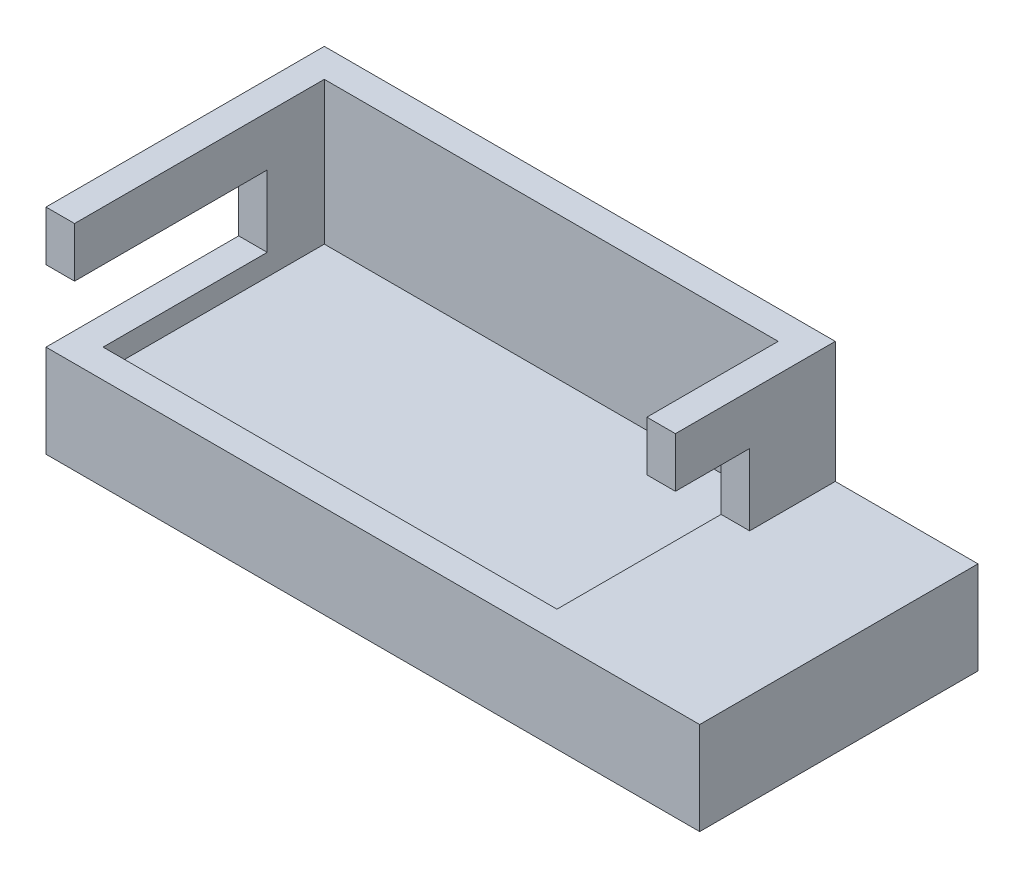
ISO-10303-21;
HEADER;
FILE_DESCRIPTION(('STEP AP214'),'2;1');
FILE_NAME('part.step','',(''),(''),'','','');
FILE_SCHEMA(('AUTOMOTIVE_DESIGN { 1 0 10303 214 1 1 1 1 }'));
ENDSEC;
DATA;
#1=APPLICATION_CONTEXT('core data for automotive mechanical design processes');
#2=APPLICATION_PROTOCOL_DEFINITION('international standard','automotive_design',2000,#1);
#3=PRODUCT_CONTEXT('',#1,'mechanical');
#4=PRODUCT('Part','Part','',(#3));
#5=PRODUCT_RELATED_PRODUCT_CATEGORY('part','',(#4));
#6=PRODUCT_DEFINITION_FORMATION('','',#4);
#7=PRODUCT_DEFINITION_CONTEXT('part definition',#1,'design');
#8=PRODUCT_DEFINITION('design','',#6,#7);
#9=PRODUCT_DEFINITION_SHAPE('','',#8);
#10=(LENGTH_UNIT() NAMED_UNIT(*) SI_UNIT(.MILLI.,.METRE.));
#11=(NAMED_UNIT(*) PLANE_ANGLE_UNIT() SI_UNIT($,.RADIAN.));
#12=(NAMED_UNIT(*) SI_UNIT($,.STERADIAN.) SOLID_ANGLE_UNIT());
#13=UNCERTAINTY_MEASURE_WITH_UNIT(LENGTH_MEASURE(1.E-05),#10,'distance_accuracy_value','');
#14=(GEOMETRIC_REPRESENTATION_CONTEXT(3) GLOBAL_UNCERTAINTY_ASSIGNED_CONTEXT((#13)) GLOBAL_UNIT_ASSIGNED_CONTEXT((#10,
#11,#12)) REPRESENTATION_CONTEXT('',''));
#15=CARTESIAN_POINT('',(0.,0.,0.));
#16=DIRECTION('',(0.,0.,1.));
#17=DIRECTION('',(1.,0.,0.));
#18=AXIS2_PLACEMENT_3D('',#15,#16,#17);
#19=CARTESIAN_POINT('',(-2.,10.,2.));
#20=DIRECTION('',(0.,0.,-1.));
#21=DIRECTION('',(-1.,0.,0.));
#22=AXIS2_PLACEMENT_3D('',#19,#20,#21);
#23=PLANE('',#22);
#24=DIRECTION('',(0.,1.,0.));
#25=VECTOR('',#24,1.);
#26=CARTESIAN_POINT('',(0.,10.,2.));
#27=LINE('',#26,#25);
#28=CARTESIAN_POINT('',(0.,6.5,2.));
#29=VERTEX_POINT('',#28);
#30=CARTESIAN_POINT('',(0.,10.,2.));
#31=VERTEX_POINT('',#30);
#32=EDGE_CURVE('E201',#29,#31,#27,.T.);
#33=ORIENTED_EDGE('',*,*,#32,.T.);
#34=DIRECTION('',(1.,0.,0.));
#35=VECTOR('',#34,1.);
#36=CARTESIAN_POINT('',(-2.,10.,2.));
#37=LINE('',#36,#35);
#38=CARTESIAN_POINT('',(-2.,10.,2.));
#39=VERTEX_POINT('',#38);
#40=EDGE_CURVE('E272',#39,#31,#37,.T.);
#41=ORIENTED_EDGE('',*,*,#40,.F.);
#42=DIRECTION('',(0.,-1.,0.));
#43=VECTOR('',#42,1.);
#44=CARTESIAN_POINT('',(-2.,10.,2.));
#45=LINE('',#44,#43);
#46=CARTESIAN_POINT('',(-2.,6.5,2.));
#47=VERTEX_POINT('',#46);
#48=EDGE_CURVE('E281',#39,#47,#45,.T.);
#49=ORIENTED_EDGE('',*,*,#48,.T.);
#50=DIRECTION('',(-1.,0.,0.));
#51=VECTOR('',#50,1.);
#52=CARTESIAN_POINT('',(-2.,6.5,2.));
#53=LINE('',#52,#51);
#54=EDGE_CURVE('E224',#29,#47,#53,.T.);
#55=ORIENTED_EDGE('',*,*,#54,.F.);
#56=EDGE_LOOP('',(#33,#41,#49,#55));
#57=FACE_BOUND('',#56,.T.);
#58=ADVANCED_FACE('F47',(#57),#23,.F.);
#59=CARTESIAN_POINT('',(-2.,6.5,-53.6474757071638));
#60=DIRECTION('',(0.,1.,0.));
#61=DIRECTION('',(-1.,0.,0.));
#62=AXIS2_PLACEMENT_3D('',#59,#60,#61);
#63=PLANE('',#62);
#64=DIRECTION('',(0.,0.,1.));
#65=VECTOR('',#64,1.);
#66=CARTESIAN_POINT('',(0.,6.5,0.));
#67=LINE('',#66,#65);
#68=CARTESIAN_POINT('',(0.,6.5,-11.5));
#69=VERTEX_POINT('',#68);
#70=EDGE_CURVE('E70',#69,#29,#67,.T.);
#71=ORIENTED_EDGE('',*,*,#70,.T.);
#72=ORIENTED_EDGE('',*,*,#54,.T.);
#73=DIRECTION('',(0.,0.,1.));
#74=VECTOR('',#73,1.);
#75=CARTESIAN_POINT('',(-2.,6.5,-53.6474757071638));
#76=LINE('',#75,#74);
#77=CARTESIAN_POINT('',(-2.,6.5,-11.5));
#78=VERTEX_POINT('',#77);
#79=EDGE_CURVE('E216',#78,#47,#76,.T.);
#80=ORIENTED_EDGE('',*,*,#79,.F.);
#81=DIRECTION('',(1.,0.,0.));
#82=VECTOR('',#81,1.);
#83=CARTESIAN_POINT('',(-2.,6.5,-11.5));
#84=LINE('',#83,#82);
#85=EDGE_CURVE('E217',#78,#69,#84,.T.);
#86=ORIENTED_EDGE('',*,*,#85,.T.);
#87=EDGE_LOOP('',(#71,#72,#80,#86));
#88=FACE_BOUND('',#87,.T.);
#89=ADVANCED_FACE('F338',(#88),#63,.F.);
#90=CARTESIAN_POINT('',(0.,10.,0.));
#91=DIRECTION('',(0.,1.,0.));
#92=DIRECTION('',(0.,0.,1.));
#93=AXIS2_PLACEMENT_3D('',#90,#91,#92);
#94=PLANE('',#93);
#95=DIRECTION('',(1.,0.,0.));
#96=VECTOR('',#95,1.);
#97=CARTESIAN_POINT('',(-9.00777441991085,10.,-6.30000000000001));
#98=LINE('',#97,#96);
#99=CARTESIAN_POINT('',(31.8,10.,-6.30000000000001));
#100=VERTEX_POINT('',#99);
#101=CARTESIAN_POINT('',(33.8,10.,-6.30000000000001));
#102=VERTEX_POINT('',#101);
#103=EDGE_CURVE('E205',#100,#102,#98,.T.);
#104=ORIENTED_EDGE('',*,*,#103,.T.);
#105=DIRECTION('',(0.,0.,-1.));
#106=VECTOR('',#105,1.);
#107=CARTESIAN_POINT('',(33.8,10.,2.));
#108=LINE('',#107,#106);
#109=CARTESIAN_POINT('',(33.8,10.,-17.5));
#110=VERTEX_POINT('',#109);
#111=EDGE_CURVE('E275',#102,#110,#108,.T.);
#112=ORIENTED_EDGE('',*,*,#111,.T.);
#113=DIRECTION('',(-1.,0.,0.));
#114=VECTOR('',#113,1.);
#115=CARTESIAN_POINT('',(-2.,10.,-17.5));
#116=LINE('',#115,#114);
#117=CARTESIAN_POINT('',(-2.,10.,-17.5));
#118=VERTEX_POINT('',#117);
#119=EDGE_CURVE('E277',#110,#118,#116,.T.);
#120=ORIENTED_EDGE('',*,*,#119,.T.);
#121=DIRECTION('',(0.,0.,1.));
#122=VECTOR('',#121,1.);
#123=CARTESIAN_POINT('',(-2.,10.,2.));
#124=LINE('',#123,#122);
#125=EDGE_CURVE('E279',#118,#39,#124,.T.);
#126=ORIENTED_EDGE('',*,*,#125,.T.);
#127=ORIENTED_EDGE('',*,*,#40,.T.);
#128=DIRECTION('',(0.,0.,1.));
#129=VECTOR('',#128,1.);
#130=CARTESIAN_POINT('',(0.,10.,0.));
#131=LINE('',#130,#129);
#132=CARTESIAN_POINT('',(0.,10.,-15.5));
#133=VERTEX_POINT('',#132);
#134=EDGE_CURVE('E247',#133,#31,#131,.T.);
#135=ORIENTED_EDGE('',*,*,#134,.F.);
#136=DIRECTION('',(-1.,0.,0.));
#137=VECTOR('',#136,1.);
#138=CARTESIAN_POINT('',(0.,10.,-15.5));
#139=LINE('',#138,#137);
#140=CARTESIAN_POINT('',(31.8,10.,-15.5));
#141=VERTEX_POINT('',#140);
#142=EDGE_CURVE('E252',#141,#133,#139,.T.);
#143=ORIENTED_EDGE('',*,*,#142,.F.);
#144=DIRECTION('',(0.,0.,-1.));
#145=VECTOR('',#144,1.);
#146=CARTESIAN_POINT('',(31.8,10.,0.));
#147=LINE('',#146,#145);
#148=EDGE_CURVE('E249',#100,#141,#147,.T.);
#149=ORIENTED_EDGE('',*,*,#148,.F.);
#150=EDGE_LOOP('',(#104,#112,#120,#126,#127,#135,#143,#149));
#151=FACE_BOUND('',#150,.T.);
#152=ADVANCED_FACE('F343',(#151),#94,.T.);
#153=DIRECTION('',(1.,0.,0.));
#154=VECTOR('',#153,1.);
#155=CARTESIAN_POINT('',(0.,-5.,2.));
#156=LINE('',#155,#154);
#157=CARTESIAN_POINT('',(-2.,-5.,2.));
#158=VERTEX_POINT('',#157);
#159=CARTESIAN_POINT('',(43.8,-5.,2.));
#160=VERTEX_POINT('',#159);
#161=EDGE_CURVE('E167',#158,#160,#156,.T.);
#162=ORIENTED_EDGE('',*,*,#161,.T.);
#163=DIRECTION('',(0.,-1.,0.));
#164=VECTOR('',#163,1.);
#165=CARTESIAN_POINT('',(43.8,23.4146070008111,2.));
#166=LINE('',#165,#164);
#167=CARTESIAN_POINT('',(43.8,1.5,2.));
#168=VERTEX_POINT('',#167);
#169=EDGE_CURVE('E170',#168,#160,#166,.T.);
#170=ORIENTED_EDGE('',*,*,#169,.F.);
#171=DIRECTION('',(1.,0.,0.));
#172=VECTOR('',#171,1.);
#173=CARTESIAN_POINT('',(-2.,1.5,2.));
#174=LINE('',#173,#172);
#175=CARTESIAN_POINT('',(-2.,1.5,2.));
#176=VERTEX_POINT('',#175);
#177=EDGE_CURVE('E211',#176,#168,#174,.T.);
#178=ORIENTED_EDGE('',*,*,#177,.F.);
#179=EDGE_CURVE('E172',#176,#158,#45,.T.);
#180=ORIENTED_EDGE('',*,*,#179,.T.);
#181=EDGE_LOOP('',(#162,#170,#178,#180));
#182=FACE_BOUND('',#181,.T.);
#183=ADVANCED_FACE('F49',(#182),#23,.F.);
#184=CARTESIAN_POINT('',(33.8,10.,2.));
#185=DIRECTION('',(-1.,0.,0.));
#186=DIRECTION('',(0.,0.,1.));
#187=AXIS2_PLACEMENT_3D('',#184,#185,#186);
#188=PLANE('',#187);
#189=DIRECTION('',(0.,-1.,0.));
#190=VECTOR('',#189,1.);
#191=CARTESIAN_POINT('',(33.8,6.5,-11.5));
#192=LINE('',#191,#190);
#193=CARTESIAN_POINT('',(33.8,6.5,-11.5));
#194=VERTEX_POINT('',#193);
#195=CARTESIAN_POINT('',(33.8,1.5,-11.5));
#196=VERTEX_POINT('',#195);
#197=EDGE_CURVE('E212',#194,#196,#192,.T.);
#198=ORIENTED_EDGE('',*,*,#197,.T.);
#199=DIRECTION('',(0.,0.,-1.));
#200=VECTOR('',#199,1.);
#201=CARTESIAN_POINT('',(33.8,1.5,0.));
#202=LINE('',#201,#200);
#203=CARTESIAN_POINT('',(33.8,1.5,-17.5));
#204=VERTEX_POINT('',#203);
#205=EDGE_CURVE('E298',#196,#204,#202,.T.);
#206=ORIENTED_EDGE('',*,*,#205,.T.);
#207=DIRECTION('',(0.,-1.,0.));
#208=VECTOR('',#207,1.);
#209=CARTESIAN_POINT('',(33.8,10.,-17.5));
#210=LINE('',#209,#208);
#211=EDGE_CURVE('E286',#110,#204,#210,.T.);
#212=ORIENTED_EDGE('',*,*,#211,.F.);
#213=ORIENTED_EDGE('',*,*,#111,.F.);
#214=DIRECTION('',(0.,1.,0.));
#215=VECTOR('',#214,1.);
#216=CARTESIAN_POINT('',(33.8,6.5,-6.30000000000001));
#217=LINE('',#216,#215);
#218=CARTESIAN_POINT('',(33.8,6.5,-6.30000000000001));
#219=VERTEX_POINT('',#218);
#220=EDGE_CURVE('E206',#219,#102,#217,.T.);
#221=ORIENTED_EDGE('',*,*,#220,.F.);
#222=DIRECTION('',(0.,0.,1.));
#223=VECTOR('',#222,1.);
#224=CARTESIAN_POINT('',(33.8,6.5,-53.6474757071638));
#225=LINE('',#224,#223);
#226=EDGE_CURVE('E229',#194,#219,#225,.T.);
#227=ORIENTED_EDGE('',*,*,#226,.F.);
#228=EDGE_LOOP('',(#198,#206,#212,#213,#221,#227));
#229=FACE_BOUND('',#228,.T.);
#230=ADVANCED_FACE('F346',(#229),#188,.F.);
#231=CARTESIAN_POINT('',(-2.,10.,-17.5));
#232=DIRECTION('',(0.,0.,1.));
#233=DIRECTION('',(1.,0.,0.));
#234=AXIS2_PLACEMENT_3D('',#231,#232,#233);
#235=PLANE('',#234);
#236=ORIENTED_EDGE('',*,*,#211,.T.);
#237=DIRECTION('',(-1.,0.,0.));
#238=VECTOR('',#237,1.);
#239=CARTESIAN_POINT('',(0.,1.5,-17.5));
#240=LINE('',#239,#238);
#241=CARTESIAN_POINT('',(43.8,1.5,-17.5));
#242=VERTEX_POINT('',#241);
#243=EDGE_CURVE('E62',#242,#204,#240,.T.);
#244=ORIENTED_EDGE('',*,*,#243,.F.);
#245=DIRECTION('',(0.,-1.,0.));
#246=VECTOR('',#245,1.);
#247=CARTESIAN_POINT('',(43.8,23.4146070008111,-17.5));
#248=LINE('',#247,#246);
#249=CARTESIAN_POINT('',(43.8,-5.,-17.5));
#250=VERTEX_POINT('',#249);
#251=EDGE_CURVE('E187',#242,#250,#248,.T.);
#252=ORIENTED_EDGE('',*,*,#251,.T.);
#253=DIRECTION('',(1.,0.,0.));
#254=VECTOR('',#253,1.);
#255=CARTESIAN_POINT('',(0.,-5.,-17.5));
#256=LINE('',#255,#254);
#257=CARTESIAN_POINT('',(-2.,-5.,-17.5));
#258=VERTEX_POINT('',#257);
#259=EDGE_CURVE('E177',#258,#250,#256,.T.);
#260=ORIENTED_EDGE('',*,*,#259,.F.);
#261=DIRECTION('',(0.,-1.,0.));
#262=VECTOR('',#261,1.);
#263=CARTESIAN_POINT('',(-2.,10.,-17.5));
#264=LINE('',#263,#262);
#265=EDGE_CURVE('E284',#118,#258,#264,.T.);
#266=ORIENTED_EDGE('',*,*,#265,.F.);
#267=ORIENTED_EDGE('',*,*,#119,.F.);
#268=EDGE_LOOP('',(#236,#244,#252,#260,#266,#267));
#269=FACE_BOUND('',#268,.T.);
#270=ADVANCED_FACE('F351',(#269),#235,.F.);
#271=CARTESIAN_POINT('',(-2.,10.,2.));
#272=DIRECTION('',(1.,0.,0.));
#273=DIRECTION('',(0.,0.,-1.));
#274=AXIS2_PLACEMENT_3D('',#271,#272,#273);
#275=PLANE('',#274);
#276=DIRECTION('',(0.,1.,0.));
#277=VECTOR('',#276,1.);
#278=CARTESIAN_POINT('',(-2.,6.5,-11.5));
#279=LINE('',#278,#277);
#280=CARTESIAN_POINT('',(-2.,1.5,-11.5));
#281=VERTEX_POINT('',#280);
#282=EDGE_CURVE('E219',#281,#78,#279,.T.);
#283=ORIENTED_EDGE('',*,*,#282,.T.);
#284=ORIENTED_EDGE('',*,*,#79,.T.);
#285=ORIENTED_EDGE('',*,*,#48,.F.);
#286=ORIENTED_EDGE('',*,*,#125,.F.);
#287=ORIENTED_EDGE('',*,*,#265,.T.);
#288=DIRECTION('',(0.,0.,-1.));
#289=VECTOR('',#288,1.);
#290=CARTESIAN_POINT('',(-2.,-5.,0.));
#291=LINE('',#290,#289);
#292=EDGE_CURVE('E178',#158,#258,#291,.T.);
#293=ORIENTED_EDGE('',*,*,#292,.F.);
#294=ORIENTED_EDGE('',*,*,#179,.F.);
#295=DIRECTION('',(0.,0.,1.));
#296=VECTOR('',#295,1.);
#297=CARTESIAN_POINT('',(-2.,1.5,-53.6474757071638));
#298=LINE('',#297,#296);
#299=EDGE_CURVE('E226',#281,#176,#298,.T.);
#300=ORIENTED_EDGE('',*,*,#299,.F.);
#301=EDGE_LOOP('',(#283,#284,#285,#286,#287,#293,#294,#300));
#302=FACE_BOUND('',#301,.T.);
#303=ADVANCED_FACE('F362',(#302),#275,.F.);
#304=CARTESIAN_POINT('',(0.,10.,0.));
#305=DIRECTION('',(1.,0.,0.));
#306=DIRECTION('',(0.,0.,-1.));
#307=AXIS2_PLACEMENT_3D('',#304,#305,#306);
#308=PLANE('',#307);
#309=ORIENTED_EDGE('',*,*,#134,.T.);
#310=ORIENTED_EDGE('',*,*,#32,.F.);
#311=ORIENTED_EDGE('',*,*,#70,.F.);
#312=DIRECTION('',(0.,-1.,0.));
#313=VECTOR('',#312,1.);
#314=CARTESIAN_POINT('',(0.,10.,-11.5));
#315=LINE('',#314,#313);
#316=CARTESIAN_POINT('',(0.,1.5,-11.5));
#317=VERTEX_POINT('',#316);
#318=EDGE_CURVE('E236',#69,#317,#315,.T.);
#319=ORIENTED_EDGE('',*,*,#318,.T.);
#320=DIRECTION('',(0.,0.,-1.));
#321=VECTOR('',#320,1.);
#322=CARTESIAN_POINT('',(0.,1.5,0.));
#323=LINE('',#322,#321);
#324=CARTESIAN_POINT('',(0.,1.5,0.));
#325=VERTEX_POINT('',#324);
#326=EDGE_CURVE('E241',#325,#317,#323,.T.);
#327=ORIENTED_EDGE('',*,*,#326,.F.);
#328=DIRECTION('',(0.,-1.,0.));
#329=VECTOR('',#328,1.);
#330=CARTESIAN_POINT('',(0.,10.,0.));
#331=LINE('',#330,#329);
#332=CARTESIAN_POINT('',(0.,0.,0.));
#333=VERTEX_POINT('',#332);
#334=EDGE_CURVE('E270',#325,#333,#331,.T.);
#335=ORIENTED_EDGE('',*,*,#334,.T.);
#336=DIRECTION('',(0.,0.,1.));
#337=VECTOR('',#336,1.);
#338=CARTESIAN_POINT('',(0.,0.,0.));
#339=LINE('',#338,#337);
#340=CARTESIAN_POINT('',(0.,0.,-15.5));
#341=VERTEX_POINT('',#340);
#342=EDGE_CURVE('E246',#341,#333,#339,.T.);
#343=ORIENTED_EDGE('',*,*,#342,.F.);
#344=DIRECTION('',(0.,-1.,0.));
#345=VECTOR('',#344,1.);
#346=CARTESIAN_POINT('',(0.,10.,-15.5));
#347=LINE('',#346,#345);
#348=EDGE_CURVE('E254',#133,#341,#347,.T.);
#349=ORIENTED_EDGE('',*,*,#348,.F.);
#350=EDGE_LOOP('',(#309,#310,#311,#319,#327,#335,#343,#349));
#351=FACE_BOUND('',#350,.T.);
#352=ADVANCED_FACE('F360',(#351),#308,.T.);
#353=CARTESIAN_POINT('',(0.,10.,0.));
#354=DIRECTION('',(0.,0.,-1.));
#355=DIRECTION('',(-1.,0.,0.));
#356=AXIS2_PLACEMENT_3D('',#353,#354,#355);
#357=PLANE('',#356);
#358=DIRECTION('',(-1.,0.,0.));
#359=VECTOR('',#358,1.);
#360=CARTESIAN_POINT('',(0.,1.5,0.));
#361=LINE('',#360,#359);
#362=CARTESIAN_POINT('',(31.8,1.5,0.));
#363=VERTEX_POINT('',#362);
#364=EDGE_CURVE('E239',#363,#325,#361,.T.);
#365=ORIENTED_EDGE('',*,*,#364,.F.);
#366=DIRECTION('',(0.,-1.,0.));
#367=VECTOR('',#366,1.);
#368=CARTESIAN_POINT('',(31.8,10.,0.));
#369=LINE('',#368,#367);
#370=CARTESIAN_POINT('',(31.8,0.,0.));
#371=VERTEX_POINT('',#370);
#372=EDGE_CURVE('E268',#363,#371,#369,.T.);
#373=ORIENTED_EDGE('',*,*,#372,.T.);
#374=DIRECTION('',(1.,0.,0.));
#375=VECTOR('',#374,1.);
#376=CARTESIAN_POINT('',(0.,0.,0.));
#377=LINE('',#376,#375);
#378=EDGE_CURVE('E257',#333,#371,#377,.T.);
#379=ORIENTED_EDGE('',*,*,#378,.F.);
#380=ORIENTED_EDGE('',*,*,#334,.F.);
#381=EDGE_LOOP('',(#365,#373,#379,#380));
#382=FACE_BOUND('',#381,.T.);
#383=ADVANCED_FACE('F397',(#382),#357,.T.);
#384=CARTESIAN_POINT('',(31.8,10.,0.));
#385=DIRECTION('',(-1.,0.,0.));
#386=DIRECTION('',(0.,0.,1.));
#387=AXIS2_PLACEMENT_3D('',#384,#385,#386);
#388=PLANE('',#387);
#389=DIRECTION('',(0.,-1.,0.));
#390=VECTOR('',#389,1.);
#391=CARTESIAN_POINT('',(31.8,10.,-6.30000000000001));
#392=LINE('',#391,#390);
#393=CARTESIAN_POINT('',(31.8,6.5,-6.30000000000001));
#394=VERTEX_POINT('',#393);
#395=EDGE_CURVE('E204',#100,#394,#392,.T.);
#396=ORIENTED_EDGE('',*,*,#395,.F.);
#397=ORIENTED_EDGE('',*,*,#148,.T.);
#398=DIRECTION('',(0.,-1.,0.));
#399=VECTOR('',#398,1.);
#400=CARTESIAN_POINT('',(31.8,10.,-15.5));
#401=LINE('',#400,#399);
#402=CARTESIAN_POINT('',(31.8,0.,-15.5));
#403=VERTEX_POINT('',#402);
#404=EDGE_CURVE('E266',#141,#403,#401,.T.);
#405=ORIENTED_EDGE('',*,*,#404,.T.);
#406=DIRECTION('',(0.,0.,-1.));
#407=VECTOR('',#406,1.);
#408=CARTESIAN_POINT('',(31.8,0.,0.));
#409=LINE('',#408,#407);
#410=EDGE_CURVE('E260',#371,#403,#409,.T.);
#411=ORIENTED_EDGE('',*,*,#410,.F.);
#412=ORIENTED_EDGE('',*,*,#372,.F.);
#413=DIRECTION('',(0.,0.,1.));
#414=VECTOR('',#413,1.);
#415=CARTESIAN_POINT('',(31.8,1.5,0.));
#416=LINE('',#415,#414);
#417=CARTESIAN_POINT('',(31.8,1.5,-11.5));
#418=VERTEX_POINT('',#417);
#419=EDGE_CURVE('E292',#418,#363,#416,.T.);
#420=ORIENTED_EDGE('',*,*,#419,.F.);
#421=DIRECTION('',(0.,1.,0.));
#422=VECTOR('',#421,1.);
#423=CARTESIAN_POINT('',(31.8,10.,-11.5));
#424=LINE('',#423,#422);
#425=CARTESIAN_POINT('',(31.8,6.5,-11.5));
#426=VERTEX_POINT('',#425);
#427=EDGE_CURVE('E289',#418,#426,#424,.T.);
#428=ORIENTED_EDGE('',*,*,#427,.T.);
#429=DIRECTION('',(0.,0.,-1.));
#430=VECTOR('',#429,1.);
#431=CARTESIAN_POINT('',(31.8,6.5,0.));
#432=LINE('',#431,#430);
#433=EDGE_CURVE('E294',#394,#426,#432,.T.);
#434=ORIENTED_EDGE('',*,*,#433,.F.);
#435=EDGE_LOOP('',(#396,#397,#405,#411,#412,#420,#428,#434));
#436=FACE_BOUND('',#435,.T.);
#437=ADVANCED_FACE('F383',(#436),#388,.T.);
#438=CARTESIAN_POINT('',(0.,10.,-15.5));
#439=DIRECTION('',(0.,0.,1.));
#440=DIRECTION('',(1.,0.,0.));
#441=AXIS2_PLACEMENT_3D('',#438,#439,#440);
#442=PLANE('',#441);
#443=DIRECTION('',(-1.,0.,0.));
#444=VECTOR('',#443,1.);
#445=CARTESIAN_POINT('',(0.,0.,-15.5));
#446=LINE('',#445,#444);
#447=EDGE_CURVE('E250',#403,#341,#446,.T.);
#448=ORIENTED_EDGE('',*,*,#447,.F.);
#449=ORIENTED_EDGE('',*,*,#404,.F.);
#450=ORIENTED_EDGE('',*,*,#142,.T.);
#451=ORIENTED_EDGE('',*,*,#348,.T.);
#452=EDGE_LOOP('',(#448,#449,#450,#451));
#453=FACE_BOUND('',#452,.T.);
#454=ADVANCED_FACE('F333',(#453),#442,.T.);
#455=CARTESIAN_POINT('',(0.,0.,0.));
#456=DIRECTION('',(0.,1.,0.));
#457=DIRECTION('',(0.,0.,1.));
#458=AXIS2_PLACEMENT_3D('',#455,#456,#457);
#459=PLANE('',#458);
#460=ORIENTED_EDGE('',*,*,#447,.T.);
#461=ORIENTED_EDGE('',*,*,#342,.T.);
#462=ORIENTED_EDGE('',*,*,#378,.T.);
#463=ORIENTED_EDGE('',*,*,#410,.T.);
#464=EDGE_LOOP('',(#460,#461,#462,#463));
#465=FACE_BOUND('',#464,.T.);
#466=ADVANCED_FACE('F321',(#465),#459,.T.);
#467=CARTESIAN_POINT('',(0.,-5.,0.));
#468=DIRECTION('',(0.,1.,0.));
#469=DIRECTION('',(0.,0.,1.));
#470=AXIS2_PLACEMENT_3D('',#467,#468,#469);
#471=PLANE('',#470);
#472=CARTESIAN_POINT('',(33.4,-5.,-7.75));
#473=DIRECTION('',(0.,1.,0.));
#474=DIRECTION('',(0.,0.,1.));
#475=AXIS2_PLACEMENT_3D('',#472,#473,#474);
#476=CIRCLE('',#475,2.49999999999999);
#477=CARTESIAN_POINT('',(33.4,-5.,-5.25));
#478=VERTEX_POINT('',#477);
#479=EDGE_CURVE('E12',#478,#478,#476,.F.);
#480=ORIENTED_EDGE('',*,*,#479,.F.);
#481=EDGE_LOOP('',(#480));
#482=FACE_BOUND('',#481,.T.);
#483=CARTESIAN_POINT('',(8.4,-5.,-7.75));
#484=DIRECTION('',(0.,1.,0.));
#485=DIRECTION('',(0.,0.,1.));
#486=AXIS2_PLACEMENT_3D('',#483,#484,#485);
#487=CIRCLE('',#486,2.5);
#488=CARTESIAN_POINT('',(8.4,-5.,-5.25));
#489=VERTEX_POINT('',#488);
#490=EDGE_CURVE('E55',#489,#489,#487,.F.);
#491=ORIENTED_EDGE('',*,*,#490,.F.);
#492=EDGE_LOOP('',(#491));
#493=FACE_BOUND('',#492,.T.);
#494=ORIENTED_EDGE('',*,*,#292,.T.);
#495=ORIENTED_EDGE('',*,*,#259,.T.);
#496=DIRECTION('',(0.,0.,-1.));
#497=VECTOR('',#496,1.);
#498=CARTESIAN_POINT('',(43.8,-5.,0.));
#499=LINE('',#498,#497);
#500=EDGE_CURVE('E185',#160,#250,#499,.T.);
#501=ORIENTED_EDGE('',*,*,#500,.F.);
#502=ORIENTED_EDGE('',*,*,#161,.F.);
#503=EDGE_LOOP('',(#494,#495,#501,#502));
#504=FACE_BOUND('',#503,.T.);
#505=ADVANCED_FACE('F189',(#482,#493,#504),#471,.F.);
#506=CARTESIAN_POINT('',(-2.,10.,-11.5));
#507=DIRECTION('',(0.,0.,1.));
#508=DIRECTION('',(1.,0.,0.));
#509=AXIS2_PLACEMENT_3D('',#506,#507,#508);
#510=PLANE('',#509);
#511=ORIENTED_EDGE('',*,*,#85,.F.);
#512=ORIENTED_EDGE('',*,*,#282,.F.);
#513=DIRECTION('',(-1.,0.,0.));
#514=VECTOR('',#513,1.);
#515=CARTESIAN_POINT('',(-2.,1.5,-11.5));
#516=LINE('',#515,#514);
#517=EDGE_CURVE('E222',#317,#281,#516,.T.);
#518=ORIENTED_EDGE('',*,*,#517,.F.);
#519=ORIENTED_EDGE('',*,*,#318,.F.);
#520=EDGE_LOOP('',(#511,#512,#518,#519));
#521=FACE_BOUND('',#520,.T.);
#522=ADVANCED_FACE('F320',(#521),#510,.T.);
#523=ORIENTED_EDGE('',*,*,#226,.T.);
#524=DIRECTION('',(-1.,0.,0.));
#525=VECTOR('',#524,1.);
#526=CARTESIAN_POINT('',(-2.,6.5,-6.30000000000001));
#527=LINE('',#526,#525);
#528=EDGE_CURVE('E296',#219,#394,#527,.T.);
#529=ORIENTED_EDGE('',*,*,#528,.T.);
#530=ORIENTED_EDGE('',*,*,#433,.T.);
#531=EDGE_CURVE('E215',#426,#194,#84,.T.);
#532=ORIENTED_EDGE('',*,*,#531,.T.);
#533=EDGE_LOOP('',(#523,#529,#530,#532));
#534=FACE_BOUND('',#533,.T.);
#535=ADVANCED_FACE('F328',(#534),#63,.F.);
#536=CARTESIAN_POINT('',(-2.,1.5,-53.6474757071638));
#537=DIRECTION('',(0.,-1.,0.));
#538=DIRECTION('',(0.,0.,-1.));
#539=AXIS2_PLACEMENT_3D('',#536,#537,#538);
#540=PLANE('',#539);
#541=ORIENTED_EDGE('',*,*,#326,.T.);
#542=ORIENTED_EDGE('',*,*,#517,.T.);
#543=ORIENTED_EDGE('',*,*,#299,.T.);
#544=ORIENTED_EDGE('',*,*,#177,.T.);
#545=DIRECTION('',(0.,0.,1.));
#546=VECTOR('',#545,1.);
#547=CARTESIAN_POINT('',(43.8,1.5,0.));
#548=LINE('',#547,#546);
#549=EDGE_CURVE('E186',#242,#168,#548,.T.);
#550=ORIENTED_EDGE('',*,*,#549,.F.);
#551=ORIENTED_EDGE('',*,*,#243,.T.);
#552=ORIENTED_EDGE('',*,*,#205,.F.);
#553=EDGE_CURVE('E233',#196,#418,#516,.T.);
#554=ORIENTED_EDGE('',*,*,#553,.T.);
#555=ORIENTED_EDGE('',*,*,#419,.T.);
#556=ORIENTED_EDGE('',*,*,#364,.T.);
#557=EDGE_LOOP('',(#541,#542,#543,#544,#550,#551,#552,#554,#555,#556));
#558=FACE_BOUND('',#557,.T.);
#559=ADVANCED_FACE('F391',(#558),#540,.F.);
#560=ORIENTED_EDGE('',*,*,#553,.F.);
#561=ORIENTED_EDGE('',*,*,#197,.F.);
#562=ORIENTED_EDGE('',*,*,#531,.F.);
#563=ORIENTED_EDGE('',*,*,#427,.F.);
#564=EDGE_LOOP('',(#560,#561,#562,#563));
#565=FACE_BOUND('',#564,.T.);
#566=ADVANCED_FACE('F331',(#565),#510,.T.);
#567=CARTESIAN_POINT('',(-9.00777441991085,6.5,-6.30000000000001));
#568=DIRECTION('',(0.,0.,-1.));
#569=DIRECTION('',(-1.,0.,0.));
#570=AXIS2_PLACEMENT_3D('',#567,#568,#569);
#571=PLANE('',#570);
#572=ORIENTED_EDGE('',*,*,#395,.T.);
#573=ORIENTED_EDGE('',*,*,#528,.F.);
#574=ORIENTED_EDGE('',*,*,#220,.T.);
#575=ORIENTED_EDGE('',*,*,#103,.F.);
#576=EDGE_LOOP('',(#572,#573,#574,#575));
#577=FACE_BOUND('',#576,.T.);
#578=ADVANCED_FACE('F380',(#577),#571,.F.);
#579=CARTESIAN_POINT('',(43.8,23.4146070008111,0.));
#580=DIRECTION('',(-1.,0.,0.));
#581=DIRECTION('',(0.,0.,1.));
#582=AXIS2_PLACEMENT_3D('',#579,#580,#581);
#583=PLANE('',#582);
#584=ORIENTED_EDGE('',*,*,#251,.F.);
#585=ORIENTED_EDGE('',*,*,#549,.T.);
#586=ORIENTED_EDGE('',*,*,#169,.T.);
#587=ORIENTED_EDGE('',*,*,#500,.T.);
#588=EDGE_LOOP('',(#584,#585,#586,#587));
#589=FACE_BOUND('',#588,.T.);
#590=ADVANCED_FACE('F184',(#589),#583,.F.);
#591=CARTESIAN_POINT('',(8.4,-10.,-7.75));
#592=DIRECTION('',(0.,1.,0.));
#593=DIRECTION('',(0.,0.,1.));
#594=AXIS2_PLACEMENT_3D('',#591,#592,#593);
#595=CYLINDRICAL_SURFACE('',#594,2.5);
#596=CARTESIAN_POINT('',(8.4,-10.,-7.75));
#597=DIRECTION('',(0.,-1.,0.));
#598=DIRECTION('',(0.,0.,-1.));
#599=AXIS2_PLACEMENT_3D('',#596,#597,#598);
#600=CIRCLE('',#599,2.5);
#601=CARTESIAN_POINT('',(8.4,-10.,-10.25));
#602=VERTEX_POINT('',#601);
#603=EDGE_CURVE('E192',#602,#602,#600,.T.);
#604=ORIENTED_EDGE('',*,*,#603,.F.);
#605=EDGE_LOOP('',(#604));
#606=FACE_BOUND('',#605,.T.);
#607=ORIENTED_EDGE('',*,*,#490,.T.);
#608=EDGE_LOOP('',(#607));
#609=FACE_BOUND('',#608,.T.);
#610=ADVANCED_FACE('F484',(#606,#609),#595,.T.);
#611=CARTESIAN_POINT('',(8.4,-10.,-7.75));
#612=DIRECTION('',(0.,-1.,0.));
#613=DIRECTION('',(0.,0.,-1.));
#614=AXIS2_PLACEMENT_3D('',#611,#612,#613);
#615=PLANE('',#614);
#616=ORIENTED_EDGE('',*,*,#603,.T.);
#617=EDGE_LOOP('',(#616));
#618=FACE_BOUND('',#617,.T.);
#619=ADVANCED_FACE('F314',(#618),#615,.T.);
#620=CARTESIAN_POINT('',(33.4,-10.,-7.75));
#621=DIRECTION('',(0.,1.,0.));
#622=DIRECTION('',(0.,0.,1.));
#623=AXIS2_PLACEMENT_3D('',#620,#621,#622);
#624=CYLINDRICAL_SURFACE('',#623,2.49999999999999);
#625=CARTESIAN_POINT('',(33.4,-10.,-7.75));
#626=DIRECTION('',(0.,-1.,0.));
#627=DIRECTION('',(0.,0.,1.));
#628=AXIS2_PLACEMENT_3D('',#625,#626,#627);
#629=CIRCLE('',#628,2.49999999999999);
#630=CARTESIAN_POINT('',(33.4,-10.,-5.25));
#631=VERTEX_POINT('',#630);
#632=EDGE_CURVE('E195',#631,#631,#629,.T.);
#633=ORIENTED_EDGE('',*,*,#632,.F.);
#634=EDGE_LOOP('',(#633));
#635=FACE_BOUND('',#634,.T.);
#636=ORIENTED_EDGE('',*,*,#479,.T.);
#637=EDGE_LOOP('',(#636));
#638=FACE_BOUND('',#637,.T.);
#639=ADVANCED_FACE('F311',(#635,#638),#624,.T.);
#640=CARTESIAN_POINT('',(33.4,-10.,-7.75));
#641=DIRECTION('',(0.,1.,0.));
#642=DIRECTION('',(0.,0.,1.));
#643=AXIS2_PLACEMENT_3D('',#640,#641,#642);
#644=PLANE('',#643);
#645=ORIENTED_EDGE('',*,*,#632,.T.);
#646=EDGE_LOOP('',(#645));
#647=FACE_BOUND('',#646,.T.);
#648=ADVANCED_FACE('F309',(#647),#644,.F.);
#649=CLOSED_SHELL('',(#58,#89,#152,#183,#230,#270,#303,#352,#383,#437,#454,#466,#505,#522,#535,
#559,#566,#578,#590,#610,#619,#639,#648));
#650=MANIFOLD_SOLID_BREP('B2',#649);
#651=ADVANCED_BREP_SHAPE_REPRESENTATION('',(#18,#650),#14);
#652=SHAPE_DEFINITION_REPRESENTATION(#9,#651);
ENDSEC;
END-ISO-10303-21;
